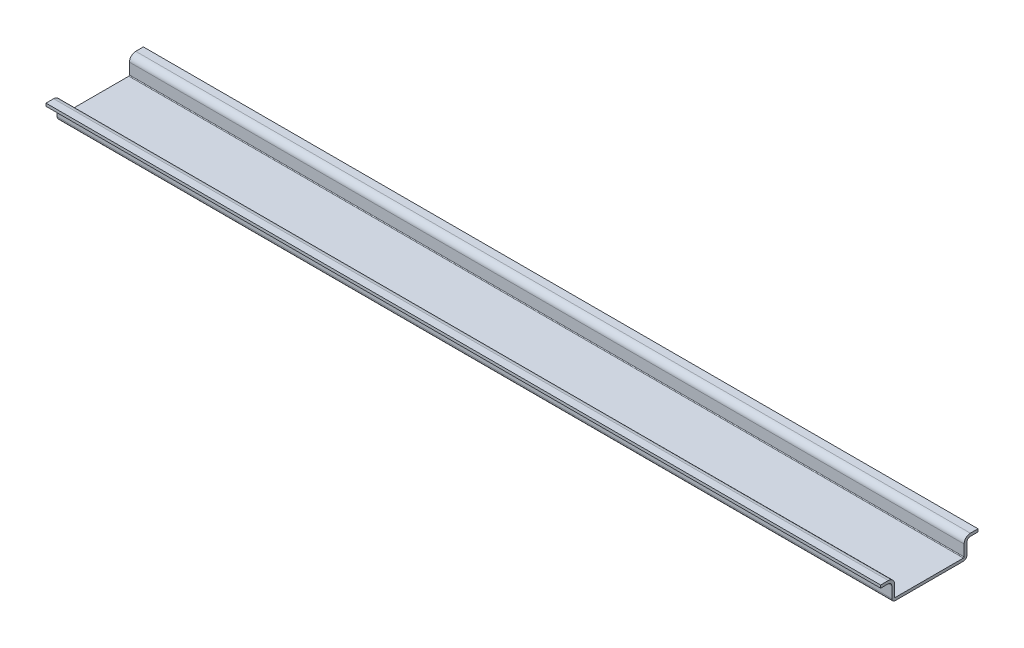
ISO-10303-21;
HEADER;
FILE_DESCRIPTION(('STEP AP214'),'2;1');
FILE_NAME('part.step','',(''),(''),'','','');
FILE_SCHEMA(('AUTOMOTIVE_DESIGN { 1 0 10303 214 1 1 1 1 }'));
ENDSEC;
DATA;
#1=APPLICATION_CONTEXT('core data for automotive mechanical design processes');
#2=APPLICATION_PROTOCOL_DEFINITION('international standard','automotive_design',2000,#1);
#3=PRODUCT_CONTEXT('',#1,'mechanical');
#4=PRODUCT('Part','Part','',(#3));
#5=PRODUCT_RELATED_PRODUCT_CATEGORY('part','',(#4));
#6=PRODUCT_DEFINITION_FORMATION('','',#4);
#7=PRODUCT_DEFINITION_CONTEXT('part definition',#1,'design');
#8=PRODUCT_DEFINITION('design','',#6,#7);
#9=PRODUCT_DEFINITION_SHAPE('','',#8);
#10=(LENGTH_UNIT() NAMED_UNIT(*) SI_UNIT(.MILLI.,.METRE.));
#11=(NAMED_UNIT(*) PLANE_ANGLE_UNIT() SI_UNIT($,.RADIAN.));
#12=(NAMED_UNIT(*) SI_UNIT($,.STERADIAN.) SOLID_ANGLE_UNIT());
#13=UNCERTAINTY_MEASURE_WITH_UNIT(LENGTH_MEASURE(1.E-05),#10,'distance_accuracy_value','');
#14=(GEOMETRIC_REPRESENTATION_CONTEXT(3) GLOBAL_UNCERTAINTY_ASSIGNED_CONTEXT((#13)) GLOBAL_UNIT_ASSIGNED_CONTEXT((#10,
#11,#12)) REPRESENTATION_CONTEXT('',''));
#15=CARTESIAN_POINT('',(0.,0.,0.));
#16=DIRECTION('',(0.,0.,1.));
#17=DIRECTION('',(1.,0.,0.));
#18=AXIS2_PLACEMENT_3D('',#15,#16,#17);
#19=CARTESIAN_POINT('',(150.,6.50000000000017,-17.5));
#20=DIRECTION('',(0.,0.,1.));
#21=DIRECTION('',(1.,0.,0.));
#22=AXIS2_PLACEMENT_3D('',#19,#20,#21);
#23=PLANE('',#22);
#24=DIRECTION('',(0.,1.,0.));
#25=VECTOR('',#24,1.);
#26=CARTESIAN_POINT('',(-150.,6.50000000000017,-17.5));
#27=LINE('',#26,#25);
#28=CARTESIAN_POINT('',(-150.,6.50000000000017,-17.5));
#29=VERTEX_POINT('',#28);
#30=CARTESIAN_POINT('',(-150.,7.5,-17.5));
#31=VERTEX_POINT('',#30);
#32=EDGE_CURVE('E270',#29,#31,#27,.T.);
#33=ORIENTED_EDGE('',*,*,#32,.T.);
#34=DIRECTION('',(-1.,0.,0.));
#35=VECTOR('',#34,1.);
#36=CARTESIAN_POINT('',(150.,7.5,-17.5));
#37=LINE('',#36,#35);
#38=CARTESIAN_POINT('',(150.,7.5,-17.5));
#39=VERTEX_POINT('',#38);
#40=EDGE_CURVE('E13',#39,#31,#37,.T.);
#41=ORIENTED_EDGE('',*,*,#40,.F.);
#42=DIRECTION('',(0.,1.,0.));
#43=VECTOR('',#42,1.);
#44=CARTESIAN_POINT('',(150.,6.50000000000017,-17.5));
#45=LINE('',#44,#43);
#46=CARTESIAN_POINT('',(150.,6.50000000000017,-17.5));
#47=VERTEX_POINT('',#46);
#48=EDGE_CURVE('E308',#47,#39,#45,.T.);
#49=ORIENTED_EDGE('',*,*,#48,.F.);
#50=DIRECTION('',(-1.,0.,0.));
#51=VECTOR('',#50,1.);
#52=CARTESIAN_POINT('',(150.,6.50000000000017,-17.5));
#53=LINE('',#52,#51);
#54=EDGE_CURVE('E266',#47,#29,#53,.T.);
#55=ORIENTED_EDGE('',*,*,#54,.T.);
#56=EDGE_LOOP('',(#33,#41,#49,#55));
#57=FACE_BOUND('',#56,.T.);
#58=ADVANCED_FACE('F102',(#57),#23,.F.);
#59=CARTESIAN_POINT('',(150.,7.5,-14.75));
#60=DIRECTION('',(0.,-1.,0.));
#61=DIRECTION('',(0.,0.,-1.));
#62=AXIS2_PLACEMENT_3D('',#59,#60,#61);
#63=PLANE('',#62);
#64=DIRECTION('',(0.,0.,1.));
#65=VECTOR('',#64,1.);
#66=CARTESIAN_POINT('',(-150.,7.5,-14.75));
#67=LINE('',#66,#65);
#68=CARTESIAN_POINT('',(-150.,7.5,-14.75));
#69=VERTEX_POINT('',#68);
#70=EDGE_CURVE('E273',#31,#69,#67,.T.);
#71=ORIENTED_EDGE('',*,*,#70,.T.);
#72=DIRECTION('',(-1.,0.,0.));
#73=VECTOR('',#72,1.);
#74=CARTESIAN_POINT('',(150.,7.5,-14.75));
#75=LINE('',#74,#73);
#76=CARTESIAN_POINT('',(150.,7.5,-14.75));
#77=VERTEX_POINT('',#76);
#78=EDGE_CURVE('E110',#77,#69,#75,.T.);
#79=ORIENTED_EDGE('',*,*,#78,.F.);
#80=DIRECTION('',(0.,0.,1.));
#81=VECTOR('',#80,1.);
#82=CARTESIAN_POINT('',(150.,7.5,-14.75));
#83=LINE('',#82,#81);
#84=EDGE_CURVE('E197',#39,#77,#83,.T.);
#85=ORIENTED_EDGE('',*,*,#84,.F.);
#86=ORIENTED_EDGE('',*,*,#40,.T.);
#87=EDGE_LOOP('',(#71,#79,#85,#86));
#88=FACE_BOUND('',#87,.T.);
#89=ADVANCED_FACE('F426',(#88),#63,.F.);
#90=CARTESIAN_POINT('',(150.,5.25,-14.75));
#91=DIRECTION('',(-1.,0.,0.));
#92=DIRECTION('',(0.,0.,1.));
#93=AXIS2_PLACEMENT_3D('',#90,#91,#92);
#94=CYLINDRICAL_SURFACE('',#93,2.25);
#95=CARTESIAN_POINT('',(-150.,5.25,-14.75));
#96=DIRECTION('',(1.,0.,0.));
#97=DIRECTION('',(0.,0.,1.));
#98=AXIS2_PLACEMENT_3D('',#95,#96,#97);
#99=CIRCLE('',#98,2.25);
#100=CARTESIAN_POINT('',(-150.,5.24999999999998,-12.5));
#101=VERTEX_POINT('',#100);
#102=EDGE_CURVE('E275',#69,#101,#99,.T.);
#103=ORIENTED_EDGE('',*,*,#102,.T.);
#104=DIRECTION('',(-1.,0.,0.));
#105=VECTOR('',#104,1.);
#106=CARTESIAN_POINT('',(150.,5.24999999999998,-12.5));
#107=LINE('',#106,#105);
#108=CARTESIAN_POINT('',(150.,5.24999999999998,-12.5));
#109=VERTEX_POINT('',#108);
#110=EDGE_CURVE('E351',#109,#101,#107,.T.);
#111=ORIENTED_EDGE('',*,*,#110,.F.);
#112=CARTESIAN_POINT('',(150.,5.25,-14.75));
#113=DIRECTION('',(1.,0.,0.));
#114=DIRECTION('',(0.,0.,1.));
#115=AXIS2_PLACEMENT_3D('',#112,#113,#114);
#116=CIRCLE('',#115,2.25);
#117=EDGE_CURVE('E359',#77,#109,#116,.T.);
#118=ORIENTED_EDGE('',*,*,#117,.F.);
#119=ORIENTED_EDGE('',*,*,#78,.T.);
#120=EDGE_LOOP('',(#103,#111,#118,#119));
#121=FACE_BOUND('',#120,.T.);
#122=ADVANCED_FACE('F357',(#121),#94,.T.);
#123=CARTESIAN_POINT('',(150.,1.24999999999999,-12.5));
#124=DIRECTION('',(0.,0.,-1.));
#125=DIRECTION('',(-1.,0.,0.));
#126=AXIS2_PLACEMENT_3D('',#123,#124,#125);
#127=PLANE('',#126);
#128=DIRECTION('',(0.,-1.,0.));
#129=VECTOR('',#128,1.);
#130=CARTESIAN_POINT('',(-150.,1.24999999999999,-12.5));
#131=LINE('',#130,#129);
#132=CARTESIAN_POINT('',(-150.,1.24999999999997,-12.5));
#133=VERTEX_POINT('',#132);
#134=EDGE_CURVE('E277',#101,#133,#131,.T.);
#135=ORIENTED_EDGE('',*,*,#134,.T.);
#136=DIRECTION('',(-1.,0.,0.));
#137=VECTOR('',#136,1.);
#138=CARTESIAN_POINT('',(150.,1.24999999999997,-12.5));
#139=LINE('',#138,#137);
#140=CARTESIAN_POINT('',(150.,1.24999999999997,-12.5));
#141=VERTEX_POINT('',#140);
#142=EDGE_CURVE('E348',#141,#133,#139,.T.);
#143=ORIENTED_EDGE('',*,*,#142,.F.);
#144=DIRECTION('',(0.,-1.,0.));
#145=VECTOR('',#144,1.);
#146=CARTESIAN_POINT('',(150.,1.24999999999999,-12.5));
#147=LINE('',#146,#145);
#148=EDGE_CURVE('E377',#109,#141,#147,.T.);
#149=ORIENTED_EDGE('',*,*,#148,.F.);
#150=ORIENTED_EDGE('',*,*,#110,.T.);
#151=EDGE_LOOP('',(#135,#143,#149,#150));
#152=FACE_BOUND('',#151,.T.);
#153=ADVANCED_FACE('F368',(#152),#127,.F.);
#154=CARTESIAN_POINT('',(150.,1.24999999999997,-12.25));
#155=DIRECTION('',(-1.,0.,0.));
#156=DIRECTION('',(0.,0.,1.));
#157=AXIS2_PLACEMENT_3D('',#154,#155,#156);
#158=CYLINDRICAL_SURFACE('',#157,0.25);
#159=CARTESIAN_POINT('',(-150.,1.24999999999997,-12.25));
#160=DIRECTION('',(-1.,0.,0.));
#161=DIRECTION('',(0.,0.,-1.));
#162=AXIS2_PLACEMENT_3D('',#159,#160,#161);
#163=CIRCLE('',#162,0.25);
#164=CARTESIAN_POINT('',(-150.,0.999999999999966,-12.25));
#165=VERTEX_POINT('',#164);
#166=EDGE_CURVE('E279',#133,#165,#163,.T.);
#167=ORIENTED_EDGE('',*,*,#166,.T.);
#168=DIRECTION('',(-1.,0.,0.));
#169=VECTOR('',#168,1.);
#170=CARTESIAN_POINT('',(150.,0.999999999999966,-12.25));
#171=LINE('',#170,#169);
#172=CARTESIAN_POINT('',(150.,0.999999999999966,-12.25));
#173=VERTEX_POINT('',#172);
#174=EDGE_CURVE('E345',#173,#165,#171,.T.);
#175=ORIENTED_EDGE('',*,*,#174,.F.);
#176=CARTESIAN_POINT('',(150.,1.24999999999997,-12.25));
#177=DIRECTION('',(-1.,0.,0.));
#178=DIRECTION('',(0.,0.,-1.));
#179=AXIS2_PLACEMENT_3D('',#176,#177,#178);
#180=CIRCLE('',#179,0.25);
#181=EDGE_CURVE('E374',#141,#173,#180,.T.);
#182=ORIENTED_EDGE('',*,*,#181,.F.);
#183=ORIENTED_EDGE('',*,*,#142,.T.);
#184=EDGE_LOOP('',(#167,#175,#182,#183));
#185=FACE_BOUND('',#184,.T.);
#186=ADVANCED_FACE('F372',(#185),#158,.F.);
#187=CARTESIAN_POINT('',(150.,0.999999999999966,-12.25));
#188=DIRECTION('',(0.,-1.,0.));
#189=DIRECTION('',(0.,0.,-1.));
#190=AXIS2_PLACEMENT_3D('',#187,#188,#189);
#191=PLANE('',#190);
#192=DIRECTION('',(0.,0.,1.));
#193=VECTOR('',#192,1.);
#194=CARTESIAN_POINT('',(-150.,0.999999999999966,-12.25));
#195=LINE('',#194,#193);
#196=CARTESIAN_POINT('',(-150.,0.999999999999964,12.25));
#197=VERTEX_POINT('',#196);
#198=EDGE_CURVE('E281',#165,#197,#195,.T.);
#199=ORIENTED_EDGE('',*,*,#198,.T.);
#200=DIRECTION('',(-1.,0.,0.));
#201=VECTOR('',#200,1.);
#202=CARTESIAN_POINT('',(150.,0.999999999999964,12.25));
#203=LINE('',#202,#201);
#204=CARTESIAN_POINT('',(150.,0.999999999999964,12.25));
#205=VERTEX_POINT('',#204);
#206=EDGE_CURVE('E342',#205,#197,#203,.T.);
#207=ORIENTED_EDGE('',*,*,#206,.F.);
#208=DIRECTION('',(0.,0.,1.));
#209=VECTOR('',#208,1.);
#210=CARTESIAN_POINT('',(150.,0.999999999999966,-12.25));
#211=LINE('',#210,#209);
#212=EDGE_CURVE('E376',#173,#205,#211,.T.);
#213=ORIENTED_EDGE('',*,*,#212,.F.);
#214=ORIENTED_EDGE('',*,*,#174,.T.);
#215=EDGE_LOOP('',(#199,#207,#213,#214));
#216=FACE_BOUND('',#215,.T.);
#217=ADVANCED_FACE('F439',(#216),#191,.F.);
#218=CARTESIAN_POINT('',(150.,1.24999999999996,12.25));
#219=DIRECTION('',(-1.,0.,0.));
#220=DIRECTION('',(0.,0.,1.));
#221=AXIS2_PLACEMENT_3D('',#218,#219,#220);
#222=CYLINDRICAL_SURFACE('',#221,0.25);
#223=CARTESIAN_POINT('',(-150.,1.24999999999996,12.25));
#224=DIRECTION('',(-1.,0.,0.));
#225=DIRECTION('',(0.,0.,1.));
#226=AXIS2_PLACEMENT_3D('',#223,#224,#225);
#227=CIRCLE('',#226,0.25);
#228=CARTESIAN_POINT('',(-150.,1.24999999999996,12.5));
#229=VERTEX_POINT('',#228);
#230=EDGE_CURVE('E283',#197,#229,#227,.T.);
#231=ORIENTED_EDGE('',*,*,#230,.T.);
#232=DIRECTION('',(-1.,0.,0.));
#233=VECTOR('',#232,1.);
#234=CARTESIAN_POINT('',(150.,1.24999999999996,12.5));
#235=LINE('',#234,#233);
#236=CARTESIAN_POINT('',(150.,1.24999999999996,12.5));
#237=VERTEX_POINT('',#236);
#238=EDGE_CURVE('E339',#237,#229,#235,.T.);
#239=ORIENTED_EDGE('',*,*,#238,.F.);
#240=CARTESIAN_POINT('',(150.,1.24999999999996,12.25));
#241=DIRECTION('',(-1.,0.,0.));
#242=DIRECTION('',(0.,0.,1.));
#243=AXIS2_PLACEMENT_3D('',#240,#241,#242);
#244=CIRCLE('',#243,0.25);
#245=EDGE_CURVE('E379',#205,#237,#244,.T.);
#246=ORIENTED_EDGE('',*,*,#245,.F.);
#247=ORIENTED_EDGE('',*,*,#206,.T.);
#248=EDGE_LOOP('',(#231,#239,#246,#247));
#249=FACE_BOUND('',#248,.T.);
#250=ADVANCED_FACE('F442',(#249),#222,.F.);
#251=CARTESIAN_POINT('',(150.,1.24999999999996,12.5));
#252=DIRECTION('',(0.,0.,1.));
#253=DIRECTION('',(1.,0.,0.));
#254=AXIS2_PLACEMENT_3D('',#251,#252,#253);
#255=PLANE('',#254);
#256=DIRECTION('',(0.,1.,0.));
#257=VECTOR('',#256,1.);
#258=CARTESIAN_POINT('',(-150.,1.24999999999996,12.5));
#259=LINE('',#258,#257);
#260=CARTESIAN_POINT('',(-150.,5.24999999999997,12.5));
#261=VERTEX_POINT('',#260);
#262=EDGE_CURVE('E285',#229,#261,#259,.T.);
#263=ORIENTED_EDGE('',*,*,#262,.T.);
#264=DIRECTION('',(-1.,0.,0.));
#265=VECTOR('',#264,1.);
#266=CARTESIAN_POINT('',(150.,5.24999999999997,12.5));
#267=LINE('',#266,#265);
#268=CARTESIAN_POINT('',(150.,5.24999999999997,12.5));
#269=VERTEX_POINT('',#268);
#270=EDGE_CURVE('E336',#269,#261,#267,.T.);
#271=ORIENTED_EDGE('',*,*,#270,.F.);
#272=DIRECTION('',(0.,1.,0.));
#273=VECTOR('',#272,1.);
#274=CARTESIAN_POINT('',(150.,1.24999999999996,12.5));
#275=LINE('',#274,#273);
#276=EDGE_CURVE('E385',#237,#269,#275,.T.);
#277=ORIENTED_EDGE('',*,*,#276,.F.);
#278=ORIENTED_EDGE('',*,*,#238,.T.);
#279=EDGE_LOOP('',(#263,#271,#277,#278));
#280=FACE_BOUND('',#279,.T.);
#281=ADVANCED_FACE('F446',(#280),#255,.F.);
#282=CARTESIAN_POINT('',(150.,5.24999999999996,14.75));
#283=DIRECTION('',(-1.,0.,0.));
#284=DIRECTION('',(0.,0.,1.));
#285=AXIS2_PLACEMENT_3D('',#282,#283,#284);
#286=CYLINDRICAL_SURFACE('',#285,2.25);
#287=CARTESIAN_POINT('',(-150.,5.24999999999996,14.75));
#288=DIRECTION('',(1.,0.,0.));
#289=DIRECTION('',(0.,0.,1.));
#290=AXIS2_PLACEMENT_3D('',#287,#288,#289);
#291=CIRCLE('',#290,2.25);
#292=CARTESIAN_POINT('',(-150.,7.49999999999996,14.75));
#293=VERTEX_POINT('',#292);
#294=EDGE_CURVE('E287',#261,#293,#291,.T.);
#295=ORIENTED_EDGE('',*,*,#294,.T.);
#296=DIRECTION('',(-1.,0.,0.));
#297=VECTOR('',#296,1.);
#298=CARTESIAN_POINT('',(150.,7.49999999999996,14.75));
#299=LINE('',#298,#297);
#300=CARTESIAN_POINT('',(150.,7.49999999999996,14.75));
#301=VERTEX_POINT('',#300);
#302=EDGE_CURVE('E333',#301,#293,#299,.T.);
#303=ORIENTED_EDGE('',*,*,#302,.F.);
#304=CARTESIAN_POINT('',(150.,5.24999999999996,14.75));
#305=DIRECTION('',(1.,0.,0.));
#306=DIRECTION('',(0.,0.,1.));
#307=AXIS2_PLACEMENT_3D('',#304,#305,#306);
#308=CIRCLE('',#307,2.25);
#309=EDGE_CURVE('E387',#269,#301,#308,.T.);
#310=ORIENTED_EDGE('',*,*,#309,.F.);
#311=ORIENTED_EDGE('',*,*,#270,.T.);
#312=EDGE_LOOP('',(#295,#303,#310,#311));
#313=FACE_BOUND('',#312,.T.);
#314=ADVANCED_FACE('F450',(#313),#286,.T.);
#315=CARTESIAN_POINT('',(150.,7.49999999999996,14.75));
#316=DIRECTION('',(0.,-1.,0.));
#317=DIRECTION('',(0.,0.,-1.));
#318=AXIS2_PLACEMENT_3D('',#315,#316,#317);
#319=PLANE('',#318);
#320=DIRECTION('',(0.,0.,1.));
#321=VECTOR('',#320,1.);
#322=CARTESIAN_POINT('',(-150.,7.49999999999996,14.75));
#323=LINE('',#322,#321);
#324=CARTESIAN_POINT('',(-150.,7.49999999999996,17.5));
#325=VERTEX_POINT('',#324);
#326=EDGE_CURVE('E289',#293,#325,#323,.T.);
#327=ORIENTED_EDGE('',*,*,#326,.T.);
#328=DIRECTION('',(-1.,0.,0.));
#329=VECTOR('',#328,1.);
#330=CARTESIAN_POINT('',(150.,7.49999999999996,17.5));
#331=LINE('',#330,#329);
#332=CARTESIAN_POINT('',(150.,7.49999999999996,17.5));
#333=VERTEX_POINT('',#332);
#334=EDGE_CURVE('E330',#333,#325,#331,.T.);
#335=ORIENTED_EDGE('',*,*,#334,.F.);
#336=DIRECTION('',(0.,0.,1.));
#337=VECTOR('',#336,1.);
#338=CARTESIAN_POINT('',(150.,7.49999999999996,14.75));
#339=LINE('',#338,#337);
#340=EDGE_CURVE('E389',#301,#333,#339,.T.);
#341=ORIENTED_EDGE('',*,*,#340,.F.);
#342=ORIENTED_EDGE('',*,*,#302,.T.);
#343=EDGE_LOOP('',(#327,#335,#341,#342));
#344=FACE_BOUND('',#343,.T.);
#345=ADVANCED_FACE('F454',(#344),#319,.F.);
#346=CARTESIAN_POINT('',(150.,6.49999999999986,17.5));
#347=DIRECTION('',(0.,0.,-1.));
#348=DIRECTION('',(-1.,0.,0.));
#349=AXIS2_PLACEMENT_3D('',#346,#347,#348);
#350=PLANE('',#349);
#351=DIRECTION('',(0.,-1.,0.));
#352=VECTOR('',#351,1.);
#353=CARTESIAN_POINT('',(-150.,6.49999999999986,17.5));
#354=LINE('',#353,#352);
#355=CARTESIAN_POINT('',(-150.,6.49999999999986,17.5));
#356=VERTEX_POINT('',#355);
#357=EDGE_CURVE('E291',#325,#356,#354,.T.);
#358=ORIENTED_EDGE('',*,*,#357,.T.);
#359=DIRECTION('',(-1.,0.,0.));
#360=VECTOR('',#359,1.);
#361=CARTESIAN_POINT('',(150.,6.49999999999986,17.5));
#362=LINE('',#361,#360);
#363=CARTESIAN_POINT('',(150.,6.49999999999986,17.5));
#364=VERTEX_POINT('',#363);
#365=EDGE_CURVE('E327',#364,#356,#362,.T.);
#366=ORIENTED_EDGE('',*,*,#365,.F.);
#367=DIRECTION('',(0.,-1.,0.));
#368=VECTOR('',#367,1.);
#369=CARTESIAN_POINT('',(150.,6.49999999999986,17.5));
#370=LINE('',#369,#368);
#371=EDGE_CURVE('E391',#333,#364,#370,.T.);
#372=ORIENTED_EDGE('',*,*,#371,.F.);
#373=ORIENTED_EDGE('',*,*,#334,.T.);
#374=EDGE_LOOP('',(#358,#366,#372,#373));
#375=FACE_BOUND('',#374,.T.);
#376=ADVANCED_FACE('F458',(#375),#350,.F.);
#377=CARTESIAN_POINT('',(150.,6.49999999999986,14.75));
#378=DIRECTION('',(0.,1.,0.));
#379=DIRECTION('',(0.,0.,1.));
#380=AXIS2_PLACEMENT_3D('',#377,#378,#379);
#381=PLANE('',#380);
#382=DIRECTION('',(0.,0.,-1.));
#383=VECTOR('',#382,1.);
#384=CARTESIAN_POINT('',(-150.,6.49999999999986,14.75));
#385=LINE('',#384,#383);
#386=CARTESIAN_POINT('',(-150.,6.49999999999986,14.75));
#387=VERTEX_POINT('',#386);
#388=EDGE_CURVE('E293',#356,#387,#385,.T.);
#389=ORIENTED_EDGE('',*,*,#388,.T.);
#390=DIRECTION('',(-1.,0.,0.));
#391=VECTOR('',#390,1.);
#392=CARTESIAN_POINT('',(150.,6.49999999999986,14.75));
#393=LINE('',#392,#391);
#394=CARTESIAN_POINT('',(150.,6.49999999999986,14.75));
#395=VERTEX_POINT('',#394);
#396=EDGE_CURVE('E324',#395,#387,#393,.T.);
#397=ORIENTED_EDGE('',*,*,#396,.F.);
#398=DIRECTION('',(0.,0.,-1.));
#399=VECTOR('',#398,1.);
#400=CARTESIAN_POINT('',(150.,6.49999999999986,14.75));
#401=LINE('',#400,#399);
#402=EDGE_CURVE('E393',#364,#395,#401,.T.);
#403=ORIENTED_EDGE('',*,*,#402,.F.);
#404=ORIENTED_EDGE('',*,*,#365,.T.);
#405=EDGE_LOOP('',(#389,#397,#403,#404));
#406=FACE_BOUND('',#405,.T.);
#407=ADVANCED_FACE('F462',(#406),#381,.F.);
#408=CARTESIAN_POINT('',(150.,5.24999999999986,14.75));
#409=DIRECTION('',(-1.,0.,0.));
#410=DIRECTION('',(0.,0.,1.));
#411=AXIS2_PLACEMENT_3D('',#408,#409,#410);
#412=CYLINDRICAL_SURFACE('',#411,1.25);
#413=CARTESIAN_POINT('',(-150.,5.24999999999986,14.75));
#414=DIRECTION('',(-1.,0.,0.));
#415=DIRECTION('',(0.,0.,1.));
#416=AXIS2_PLACEMENT_3D('',#413,#414,#415);
#417=CIRCLE('',#416,1.25);
#418=CARTESIAN_POINT('',(-150.,5.24999999999986,13.5));
#419=VERTEX_POINT('',#418);
#420=EDGE_CURVE('E295',#387,#419,#417,.T.);
#421=ORIENTED_EDGE('',*,*,#420,.T.);
#422=DIRECTION('',(-1.,0.,0.));
#423=VECTOR('',#422,1.);
#424=CARTESIAN_POINT('',(150.,5.24999999999986,13.5));
#425=LINE('',#424,#423);
#426=CARTESIAN_POINT('',(150.,5.24999999999986,13.5));
#427=VERTEX_POINT('',#426);
#428=EDGE_CURVE('E321',#427,#419,#425,.T.);
#429=ORIENTED_EDGE('',*,*,#428,.F.);
#430=CARTESIAN_POINT('',(150.,5.24999999999986,14.75));
#431=DIRECTION('',(-1.,0.,0.));
#432=DIRECTION('',(0.,0.,1.));
#433=AXIS2_PLACEMENT_3D('',#430,#431,#432);
#434=CIRCLE('',#433,1.25);
#435=EDGE_CURVE('E395',#395,#427,#434,.T.);
#436=ORIENTED_EDGE('',*,*,#435,.F.);
#437=ORIENTED_EDGE('',*,*,#396,.T.);
#438=EDGE_LOOP('',(#421,#429,#436,#437));
#439=FACE_BOUND('',#438,.T.);
#440=ADVANCED_FACE('F466',(#439),#412,.F.);
#441=CARTESIAN_POINT('',(150.,1.25,13.5));
#442=DIRECTION('',(0.,0.,-1.));
#443=DIRECTION('',(-1.,0.,0.));
#444=AXIS2_PLACEMENT_3D('',#441,#442,#443);
#445=PLANE('',#444);
#446=DIRECTION('',(0.,-1.,0.));
#447=VECTOR('',#446,1.);
#448=CARTESIAN_POINT('',(-150.,1.25,13.5));
#449=LINE('',#448,#447);
#450=CARTESIAN_POINT('',(-150.,1.25,13.5));
#451=VERTEX_POINT('',#450);
#452=EDGE_CURVE('E297',#419,#451,#449,.T.);
#453=ORIENTED_EDGE('',*,*,#452,.T.);
#454=DIRECTION('',(-1.,0.,0.));
#455=VECTOR('',#454,1.);
#456=CARTESIAN_POINT('',(150.,1.25,13.5));
#457=LINE('',#456,#455);
#458=CARTESIAN_POINT('',(150.,1.25,13.5));
#459=VERTEX_POINT('',#458);
#460=EDGE_CURVE('E318',#459,#451,#457,.T.);
#461=ORIENTED_EDGE('',*,*,#460,.F.);
#462=DIRECTION('',(0.,-1.,0.));
#463=VECTOR('',#462,1.);
#464=CARTESIAN_POINT('',(150.,1.25,13.5));
#465=LINE('',#464,#463);
#466=EDGE_CURVE('E397',#427,#459,#465,.T.);
#467=ORIENTED_EDGE('',*,*,#466,.F.);
#468=ORIENTED_EDGE('',*,*,#428,.T.);
#469=EDGE_LOOP('',(#453,#461,#467,#468));
#470=FACE_BOUND('',#469,.T.);
#471=ADVANCED_FACE('F470',(#470),#445,.F.);
#472=CARTESIAN_POINT('',(150.,1.25,12.25));
#473=DIRECTION('',(-1.,0.,0.));
#474=DIRECTION('',(0.,0.,1.));
#475=AXIS2_PLACEMENT_3D('',#472,#473,#474);
#476=CYLINDRICAL_SURFACE('',#475,1.25);
#477=CARTESIAN_POINT('',(-150.,1.25,12.25));
#478=DIRECTION('',(1.,0.,0.));
#479=DIRECTION('',(0.,0.,1.));
#480=AXIS2_PLACEMENT_3D('',#477,#478,#479);
#481=CIRCLE('',#480,1.25);
#482=CARTESIAN_POINT('',(-150.,0.,12.25));
#483=VERTEX_POINT('',#482);
#484=EDGE_CURVE('E299',#451,#483,#481,.T.);
#485=ORIENTED_EDGE('',*,*,#484,.T.);
#486=DIRECTION('',(-1.,0.,0.));
#487=VECTOR('',#486,1.);
#488=CARTESIAN_POINT('',(150.,0.,12.25));
#489=LINE('',#488,#487);
#490=CARTESIAN_POINT('',(150.,0.,12.25));
#491=VERTEX_POINT('',#490);
#492=EDGE_CURVE('E315',#491,#483,#489,.T.);
#493=ORIENTED_EDGE('',*,*,#492,.F.);
#494=CARTESIAN_POINT('',(150.,1.25,12.25));
#495=DIRECTION('',(1.,0.,0.));
#496=DIRECTION('',(0.,0.,1.));
#497=AXIS2_PLACEMENT_3D('',#494,#495,#496);
#498=CIRCLE('',#497,1.25);
#499=EDGE_CURVE('E399',#459,#491,#498,.T.);
#500=ORIENTED_EDGE('',*,*,#499,.F.);
#501=ORIENTED_EDGE('',*,*,#460,.T.);
#502=EDGE_LOOP('',(#485,#493,#500,#501));
#503=FACE_BOUND('',#502,.T.);
#504=ADVANCED_FACE('F474',(#503),#476,.T.);
#505=CARTESIAN_POINT('',(150.,0.,-12.25));
#506=DIRECTION('',(0.,1.,0.));
#507=DIRECTION('',(0.,0.,1.));
#508=AXIS2_PLACEMENT_3D('',#505,#506,#507);
#509=PLANE('',#508);
#510=DIRECTION('',(0.,0.,-1.));
#511=VECTOR('',#510,1.);
#512=CARTESIAN_POINT('',(-150.,0.,-12.25));
#513=LINE('',#512,#511);
#514=CARTESIAN_POINT('',(-150.,0.,-12.25));
#515=VERTEX_POINT('',#514);
#516=EDGE_CURVE('E301',#483,#515,#513,.T.);
#517=ORIENTED_EDGE('',*,*,#516,.T.);
#518=DIRECTION('',(-1.,0.,0.));
#519=VECTOR('',#518,1.);
#520=CARTESIAN_POINT('',(150.,0.,-12.25));
#521=LINE('',#520,#519);
#522=CARTESIAN_POINT('',(150.,0.,-12.25));
#523=VERTEX_POINT('',#522);
#524=EDGE_CURVE('E312',#523,#515,#521,.T.);
#525=ORIENTED_EDGE('',*,*,#524,.F.);
#526=DIRECTION('',(0.,0.,-1.));
#527=VECTOR('',#526,1.);
#528=CARTESIAN_POINT('',(150.,0.,-12.25));
#529=LINE('',#528,#527);
#530=EDGE_CURVE('E401',#491,#523,#529,.T.);
#531=ORIENTED_EDGE('',*,*,#530,.F.);
#532=ORIENTED_EDGE('',*,*,#492,.T.);
#533=EDGE_LOOP('',(#517,#525,#531,#532));
#534=FACE_BOUND('',#533,.T.);
#535=ADVANCED_FACE('F407',(#534),#509,.F.);
#536=CARTESIAN_POINT('',(150.,1.25,-12.25));
#537=DIRECTION('',(-1.,0.,0.));
#538=DIRECTION('',(0.,0.,1.));
#539=AXIS2_PLACEMENT_3D('',#536,#537,#538);
#540=CYLINDRICAL_SURFACE('',#539,1.24999999999998);
#541=CARTESIAN_POINT('',(-150.,1.25,-12.25));
#542=DIRECTION('',(1.,0.,0.));
#543=DIRECTION('',(0.,0.,-1.));
#544=AXIS2_PLACEMENT_3D('',#541,#542,#543);
#545=CIRCLE('',#544,1.24999999999998);
#546=CARTESIAN_POINT('',(-150.,1.25,-13.5));
#547=VERTEX_POINT('',#546);
#548=EDGE_CURVE('E303',#515,#547,#545,.T.);
#549=ORIENTED_EDGE('',*,*,#548,.T.);
#550=DIRECTION('',(-1.,0.,0.));
#551=VECTOR('',#550,1.);
#552=CARTESIAN_POINT('',(150.,1.25,-13.5));
#553=LINE('',#552,#551);
#554=CARTESIAN_POINT('',(150.,1.25,-13.5));
#555=VERTEX_POINT('',#554);
#556=EDGE_CURVE('E261',#555,#547,#553,.T.);
#557=ORIENTED_EDGE('',*,*,#556,.F.);
#558=CARTESIAN_POINT('',(150.,1.25,-12.25));
#559=DIRECTION('',(1.,0.,0.));
#560=DIRECTION('',(0.,0.,-1.));
#561=AXIS2_PLACEMENT_3D('',#558,#559,#560);
#562=CIRCLE('',#561,1.24999999999998);
#563=EDGE_CURVE('E252',#523,#555,#562,.T.);
#564=ORIENTED_EDGE('',*,*,#563,.F.);
#565=ORIENTED_EDGE('',*,*,#524,.T.);
#566=EDGE_LOOP('',(#549,#557,#564,#565));
#567=FACE_BOUND('',#566,.T.);
#568=ADVANCED_FACE('F411',(#567),#540,.T.);
#569=CARTESIAN_POINT('',(150.,1.25,-13.5));
#570=DIRECTION('',(0.,0.,1.));
#571=DIRECTION('',(1.,0.,0.));
#572=AXIS2_PLACEMENT_3D('',#569,#570,#571);
#573=PLANE('',#572);
#574=DIRECTION('',(0.,1.,0.));
#575=VECTOR('',#574,1.);
#576=CARTESIAN_POINT('',(-150.,1.25,-13.5));
#577=LINE('',#576,#575);
#578=CARTESIAN_POINT('',(-150.,5.25000000000017,-13.5));
#579=VERTEX_POINT('',#578);
#580=EDGE_CURVE('E260',#547,#579,#577,.T.);
#581=ORIENTED_EDGE('',*,*,#580,.T.);
#582=DIRECTION('',(-1.,0.,0.));
#583=VECTOR('',#582,1.);
#584=CARTESIAN_POINT('',(150.,5.25000000000017,-13.5));
#585=LINE('',#584,#583);
#586=CARTESIAN_POINT('',(150.,5.25000000000017,-13.5));
#587=VERTEX_POINT('',#586);
#588=EDGE_CURVE('E257',#587,#579,#585,.T.);
#589=ORIENTED_EDGE('',*,*,#588,.F.);
#590=DIRECTION('',(0.,1.,0.));
#591=VECTOR('',#590,1.);
#592=CARTESIAN_POINT('',(150.,1.25,-13.5));
#593=LINE('',#592,#591);
#594=EDGE_CURVE('E246',#555,#587,#593,.T.);
#595=ORIENTED_EDGE('',*,*,#594,.F.);
#596=ORIENTED_EDGE('',*,*,#556,.T.);
#597=EDGE_LOOP('',(#581,#589,#595,#596));
#598=FACE_BOUND('',#597,.T.);
#599=ADVANCED_FACE('F258',(#598),#573,.F.);
#600=CARTESIAN_POINT('',(150.,5.25000000000017,-14.75));
#601=DIRECTION('',(-1.,0.,0.));
#602=DIRECTION('',(0.,0.,1.));
#603=AXIS2_PLACEMENT_3D('',#600,#601,#602);
#604=CYLINDRICAL_SURFACE('',#603,1.25);
#605=CARTESIAN_POINT('',(-150.,5.25000000000017,-14.75));
#606=DIRECTION('',(-1.,0.,0.));
#607=DIRECTION('',(0.,0.,1.));
#608=AXIS2_PLACEMENT_3D('',#605,#606,#607);
#609=CIRCLE('',#608,1.25);
#610=CARTESIAN_POINT('',(-150.,6.50000000000017,-14.75));
#611=VERTEX_POINT('',#610);
#612=EDGE_CURVE('E183',#579,#611,#609,.T.);
#613=ORIENTED_EDGE('',*,*,#612,.T.);
#614=DIRECTION('',(-1.,0.,0.));
#615=VECTOR('',#614,1.);
#616=CARTESIAN_POINT('',(150.,6.50000000000017,-14.75));
#617=LINE('',#616,#615);
#618=CARTESIAN_POINT('',(150.,6.50000000000017,-14.75));
#619=VERTEX_POINT('',#618);
#620=EDGE_CURVE('E262',#619,#611,#617,.T.);
#621=ORIENTED_EDGE('',*,*,#620,.F.);
#622=CARTESIAN_POINT('',(150.,5.25000000000017,-14.75));
#623=DIRECTION('',(-1.,0.,0.));
#624=DIRECTION('',(0.,0.,1.));
#625=AXIS2_PLACEMENT_3D('',#622,#623,#624);
#626=CIRCLE('',#625,1.25);
#627=EDGE_CURVE('E250',#587,#619,#626,.T.);
#628=ORIENTED_EDGE('',*,*,#627,.F.);
#629=ORIENTED_EDGE('',*,*,#588,.T.);
#630=EDGE_LOOP('',(#613,#621,#628,#629));
#631=FACE_BOUND('',#630,.T.);
#632=ADVANCED_FACE('F264',(#631),#604,.F.);
#633=CARTESIAN_POINT('',(150.,6.50000000000017,-14.75));
#634=DIRECTION('',(0.,1.,0.));
#635=DIRECTION('',(0.,0.,1.));
#636=AXIS2_PLACEMENT_3D('',#633,#634,#635);
#637=PLANE('',#636);
#638=DIRECTION('',(0.,0.,-1.));
#639=VECTOR('',#638,1.);
#640=CARTESIAN_POINT('',(-150.,6.50000000000017,-14.75));
#641=LINE('',#640,#639);
#642=EDGE_CURVE('E189',#611,#29,#641,.T.);
#643=ORIENTED_EDGE('',*,*,#642,.T.);
#644=ORIENTED_EDGE('',*,*,#54,.F.);
#645=DIRECTION('',(0.,0.,-1.));
#646=VECTOR('',#645,1.);
#647=CARTESIAN_POINT('',(150.,6.50000000000017,-14.75));
#648=LINE('',#647,#646);
#649=EDGE_CURVE('E118',#619,#47,#648,.T.);
#650=ORIENTED_EDGE('',*,*,#649,.F.);
#651=ORIENTED_EDGE('',*,*,#620,.T.);
#652=EDGE_LOOP('',(#643,#644,#650,#651));
#653=FACE_BOUND('',#652,.T.);
#654=ADVANCED_FACE('F415',(#653),#637,.F.);
#655=CARTESIAN_POINT('',(150.,5.25,-14.75));
#656=DIRECTION('',(-1.,0.,0.));
#657=DIRECTION('',(0.,0.,1.));
#658=AXIS2_PLACEMENT_3D('',#655,#656,#657);
#659=PLANE('',#658);
#660=ORIENTED_EDGE('',*,*,#48,.T.);
#661=ORIENTED_EDGE('',*,*,#84,.T.);
#662=ORIENTED_EDGE('',*,*,#117,.T.);
#663=ORIENTED_EDGE('',*,*,#148,.T.);
#664=ORIENTED_EDGE('',*,*,#181,.T.);
#665=ORIENTED_EDGE('',*,*,#212,.T.);
#666=ORIENTED_EDGE('',*,*,#245,.T.);
#667=ORIENTED_EDGE('',*,*,#276,.T.);
#668=ORIENTED_EDGE('',*,*,#309,.T.);
#669=ORIENTED_EDGE('',*,*,#340,.T.);
#670=ORIENTED_EDGE('',*,*,#371,.T.);
#671=ORIENTED_EDGE('',*,*,#402,.T.);
#672=ORIENTED_EDGE('',*,*,#435,.T.);
#673=ORIENTED_EDGE('',*,*,#466,.T.);
#674=ORIENTED_EDGE('',*,*,#499,.T.);
#675=ORIENTED_EDGE('',*,*,#530,.T.);
#676=ORIENTED_EDGE('',*,*,#563,.T.);
#677=ORIENTED_EDGE('',*,*,#594,.T.);
#678=ORIENTED_EDGE('',*,*,#627,.T.);
#679=ORIENTED_EDGE('',*,*,#649,.T.);
#680=EDGE_LOOP('',(#660,#661,#662,#663,#664,#665,#666,#667,#668,#669,#670,#671,#672,#673,#674,
#675,#676,#677,#678,#679));
#681=FACE_BOUND('',#680,.T.);
#682=ADVANCED_FACE('F248',(#681),#659,.F.);
#683=CARTESIAN_POINT('',(-150.,5.25,-14.75));
#684=DIRECTION('',(-1.,0.,0.));
#685=DIRECTION('',(0.,0.,1.));
#686=AXIS2_PLACEMENT_3D('',#683,#684,#685);
#687=PLANE('',#686);
#688=ORIENTED_EDGE('',*,*,#32,.F.);
#689=ORIENTED_EDGE('',*,*,#642,.F.);
#690=ORIENTED_EDGE('',*,*,#612,.F.);
#691=ORIENTED_EDGE('',*,*,#580,.F.);
#692=ORIENTED_EDGE('',*,*,#548,.F.);
#693=ORIENTED_EDGE('',*,*,#516,.F.);
#694=ORIENTED_EDGE('',*,*,#484,.F.);
#695=ORIENTED_EDGE('',*,*,#452,.F.);
#696=ORIENTED_EDGE('',*,*,#420,.F.);
#697=ORIENTED_EDGE('',*,*,#388,.F.);
#698=ORIENTED_EDGE('',*,*,#357,.F.);
#699=ORIENTED_EDGE('',*,*,#326,.F.);
#700=ORIENTED_EDGE('',*,*,#294,.F.);
#701=ORIENTED_EDGE('',*,*,#262,.F.);
#702=ORIENTED_EDGE('',*,*,#230,.F.);
#703=ORIENTED_EDGE('',*,*,#198,.F.);
#704=ORIENTED_EDGE('',*,*,#166,.F.);
#705=ORIENTED_EDGE('',*,*,#134,.F.);
#706=ORIENTED_EDGE('',*,*,#102,.F.);
#707=ORIENTED_EDGE('',*,*,#70,.F.);
#708=EDGE_LOOP('',(#688,#689,#690,#691,#692,#693,#694,#695,#696,#697,#698,#699,#700,#701,#702,
#703,#704,#705,#706,#707));
#709=FACE_BOUND('',#708,.T.);
#710=ADVANCED_FACE('F363',(#709),#687,.T.);
#711=CLOSED_SHELL('',(#58,#89,#122,#153,#186,#217,#250,#281,#314,#345,#376,#407,#440,#471,#504,
#535,#568,#599,#632,#654,#682,#710));
#712=MANIFOLD_SOLID_BREP('B2',#711);
#713=ADVANCED_BREP_SHAPE_REPRESENTATION('',(#18,#712),#14);
#714=SHAPE_DEFINITION_REPRESENTATION(#9,#713);
ENDSEC;
END-ISO-10303-21;
